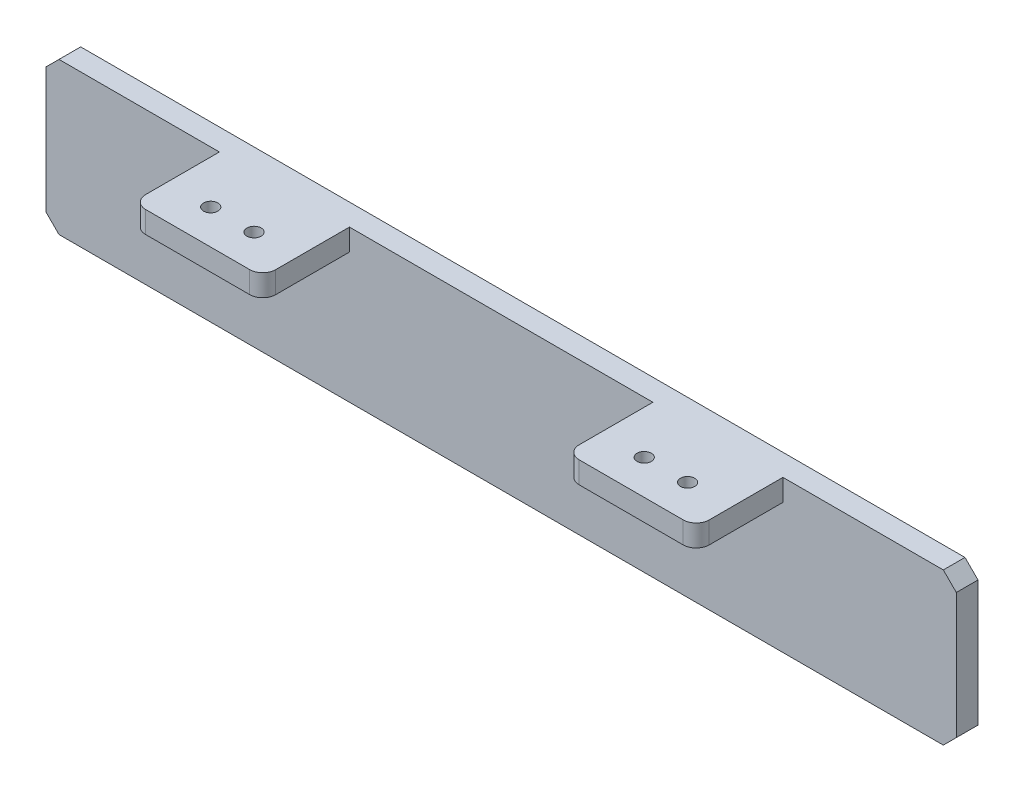
ISO-10303-21;
HEADER;
FILE_DESCRIPTION(('STEP AP214'),'2;1');
FILE_NAME('part.step','',(''),(''),'','','');
FILE_SCHEMA(('AUTOMOTIVE_DESIGN { 1 0 10303 214 1 1 1 1 }'));
ENDSEC;
DATA;
#1=APPLICATION_CONTEXT('core data for automotive mechanical design processes');
#2=APPLICATION_PROTOCOL_DEFINITION('international standard','automotive_design',2000,#1);
#3=PRODUCT_CONTEXT('',#1,'mechanical');
#4=PRODUCT('Part','Part','',(#3));
#5=PRODUCT_RELATED_PRODUCT_CATEGORY('part','',(#4));
#6=PRODUCT_DEFINITION_FORMATION('','',#4);
#7=PRODUCT_DEFINITION_CONTEXT('part definition',#1,'design');
#8=PRODUCT_DEFINITION('design','',#6,#7);
#9=PRODUCT_DEFINITION_SHAPE('','',#8);
#10=(LENGTH_UNIT() NAMED_UNIT(*) SI_UNIT(.MILLI.,.METRE.));
#11=(NAMED_UNIT(*) PLANE_ANGLE_UNIT() SI_UNIT($,.RADIAN.));
#12=(NAMED_UNIT(*) SI_UNIT($,.STERADIAN.) SOLID_ANGLE_UNIT());
#13=UNCERTAINTY_MEASURE_WITH_UNIT(LENGTH_MEASURE(1.E-05),#10,'distance_accuracy_value','');
#14=(GEOMETRIC_REPRESENTATION_CONTEXT(3) GLOBAL_UNCERTAINTY_ASSIGNED_CONTEXT((#13)) GLOBAL_UNIT_ASSIGNED_CONTEXT((#10,
#11,#12)) REPRESENTATION_CONTEXT('',''));
#15=CARTESIAN_POINT('',(0.,0.,0.));
#16=DIRECTION('',(0.,0.,1.));
#17=DIRECTION('',(1.,0.,0.));
#18=AXIS2_PLACEMENT_3D('',#15,#16,#17);
#19=CARTESIAN_POINT('',(0.,0.,5.));
#20=DIRECTION('',(0.,0.,-1.));
#21=DIRECTION('',(-1.,0.,0.));
#22=AXIS2_PLACEMENT_3D('',#19,#20,#21);
#23=PLANE('',#22);
#24=DIRECTION('',(0.,-1.,0.));
#25=VECTOR('',#24,1.);
#26=CARTESIAN_POINT('',(0.,0.,5.));
#27=LINE('',#26,#25);
#28=CARTESIAN_POINT('',(0.,32.,5.));
#29=VERTEX_POINT('',#28);
#30=CARTESIAN_POINT('',(0.,3.,5.));
#31=VERTEX_POINT('',#30);
#32=EDGE_CURVE('E241',#29,#31,#27,.T.);
#33=ORIENTED_EDGE('',*,*,#32,.T.);
#34=DIRECTION('',(-0.707106781186548,0.707106781186548,0.));
#35=VECTOR('',#34,1.);
#36=CARTESIAN_POINT('',(3.,0.,5.));
#37=LINE('',#36,#35);
#38=CARTESIAN_POINT('',(3.,0.,5.));
#39=VERTEX_POINT('',#38);
#40=EDGE_CURVE('E329',#31,#39,#37,.F.);
#41=ORIENTED_EDGE('',*,*,#40,.T.);
#42=DIRECTION('',(1.,0.,0.));
#43=VECTOR('',#42,1.);
#44=CARTESIAN_POINT('',(0.,0.,5.));
#45=LINE('',#44,#43);
#46=CARTESIAN_POINT('',(207.,0.,5.));
#47=VERTEX_POINT('',#46);
#48=EDGE_CURVE('E243',#39,#47,#45,.T.);
#49=ORIENTED_EDGE('',*,*,#48,.T.);
#50=DIRECTION('',(-0.707106781186548,-0.707106781186548,0.));
#51=VECTOR('',#50,1.);
#52=CARTESIAN_POINT('',(210.,3.,5.));
#53=LINE('',#52,#51);
#54=CARTESIAN_POINT('',(210.,3.,5.));
#55=VERTEX_POINT('',#54);
#56=EDGE_CURVE('E325',#47,#55,#53,.F.);
#57=ORIENTED_EDGE('',*,*,#56,.T.);
#58=DIRECTION('',(0.,1.,0.));
#59=VECTOR('',#58,1.);
#60=CARTESIAN_POINT('',(210.,0.,5.));
#61=LINE('',#60,#59);
#62=CARTESIAN_POINT('',(210.,32.,5.));
#63=VERTEX_POINT('',#62);
#64=EDGE_CURVE('E247',#55,#63,#61,.T.);
#65=ORIENTED_EDGE('',*,*,#64,.T.);
#66=DIRECTION('',(0.707106781186548,-0.707106781186548,0.));
#67=VECTOR('',#66,1.);
#68=CARTESIAN_POINT('',(207.,35.,5.));
#69=LINE('',#68,#67);
#70=CARTESIAN_POINT('',(207.,35.,5.));
#71=VERTEX_POINT('',#70);
#72=EDGE_CURVE('E57',#63,#71,#69,.F.);
#73=ORIENTED_EDGE('',*,*,#72,.T.);
#74=DIRECTION('',(-1.,0.,0.));
#75=VECTOR('',#74,1.);
#76=CARTESIAN_POINT('',(0.,35.,5.));
#77=LINE('',#76,#75);
#78=CARTESIAN_POINT('',(170.,35.,5.));
#79=VERTEX_POINT('',#78);
#80=EDGE_CURVE('E201',#71,#79,#77,.T.);
#81=ORIENTED_EDGE('',*,*,#80,.T.);
#82=DIRECTION('',(0.,1.,0.));
#83=VECTOR('',#82,1.);
#84=CARTESIAN_POINT('',(170.,35.,5.));
#85=LINE('',#84,#83);
#86=CARTESIAN_POINT('',(170.,30.,5.));
#87=VERTEX_POINT('',#86);
#88=EDGE_CURVE('E214',#87,#79,#85,.T.);
#89=ORIENTED_EDGE('',*,*,#88,.F.);
#90=DIRECTION('',(1.,0.,0.));
#91=VECTOR('',#90,1.);
#92=CARTESIAN_POINT('',(140.,30.,5.));
#93=LINE('',#92,#91);
#94=CARTESIAN_POINT('',(140.,30.,5.));
#95=VERTEX_POINT('',#94);
#96=EDGE_CURVE('E208',#95,#87,#93,.T.);
#97=ORIENTED_EDGE('',*,*,#96,.F.);
#98=DIRECTION('',(0.,-1.,0.));
#99=VECTOR('',#98,1.);
#100=CARTESIAN_POINT('',(140.,35.,5.));
#101=LINE('',#100,#99);
#102=CARTESIAN_POINT('',(140.,35.,5.));
#103=VERTEX_POINT('',#102);
#104=EDGE_CURVE('E185',#103,#95,#101,.T.);
#105=ORIENTED_EDGE('',*,*,#104,.F.);
#106=CARTESIAN_POINT('',(70.,35.,5.));
#107=VERTEX_POINT('',#106);
#108=EDGE_CURVE('E194',#103,#107,#77,.T.);
#109=ORIENTED_EDGE('',*,*,#108,.T.);
#110=DIRECTION('',(0.,1.,0.));
#111=VECTOR('',#110,1.);
#112=CARTESIAN_POINT('',(70.,35.,5.));
#113=LINE('',#112,#111);
#114=CARTESIAN_POINT('',(70.,30.,5.));
#115=VERTEX_POINT('',#114);
#116=EDGE_CURVE('E227',#115,#107,#113,.T.);
#117=ORIENTED_EDGE('',*,*,#116,.F.);
#118=DIRECTION('',(1.,0.,0.));
#119=VECTOR('',#118,1.);
#120=CARTESIAN_POINT('',(40.,30.,5.));
#121=LINE('',#120,#119);
#122=CARTESIAN_POINT('',(40.,30.,5.));
#123=VERTEX_POINT('',#122);
#124=EDGE_CURVE('E212',#123,#115,#121,.T.);
#125=ORIENTED_EDGE('',*,*,#124,.F.);
#126=DIRECTION('',(0.,-1.,0.));
#127=VECTOR('',#126,1.);
#128=CARTESIAN_POINT('',(40.,35.,5.));
#129=LINE('',#128,#127);
#130=CARTESIAN_POINT('',(40.,35.,5.));
#131=VERTEX_POINT('',#130);
#132=EDGE_CURVE('E209',#131,#123,#129,.T.);
#133=ORIENTED_EDGE('',*,*,#132,.F.);
#134=CARTESIAN_POINT('',(3.00000000000003,35.,5.));
#135=VERTEX_POINT('',#134);
#136=EDGE_CURVE('E202',#131,#135,#77,.T.);
#137=ORIENTED_EDGE('',*,*,#136,.T.);
#138=DIRECTION('',(0.707106781186551,0.707106781186544,0.));
#139=VECTOR('',#138,1.);
#140=CARTESIAN_POINT('',(0.,32.,5.));
#141=LINE('',#140,#139);
#142=EDGE_CURVE('E327',#135,#29,#141,.F.);
#143=ORIENTED_EDGE('',*,*,#142,.T.);
#144=EDGE_LOOP('',(#33,#41,#49,#57,#65,#73,#81,#89,#97,#105,#109,#117,#125,#133,#137,#143));
#145=FACE_BOUND('',#144,.T.);
#146=ADVANCED_FACE('F41',(#145),#23,.F.);
#147=CARTESIAN_POINT('',(0.,0.,5.));
#148=DIRECTION('',(1.,0.,0.));
#149=DIRECTION('',(0.,0.,-1.));
#150=AXIS2_PLACEMENT_3D('',#147,#148,#149);
#151=PLANE('',#150);
#152=DIRECTION('',(0.,-1.,0.));
#153=VECTOR('',#152,1.);
#154=CARTESIAN_POINT('',(0.,0.,0.));
#155=LINE('',#154,#153);
#156=CARTESIAN_POINT('',(0.,32.,0.));
#157=VERTEX_POINT('',#156);
#158=CARTESIAN_POINT('',(0.,3.,0.));
#159=VERTEX_POINT('',#158);
#160=EDGE_CURVE('E240',#157,#159,#155,.T.);
#161=ORIENTED_EDGE('',*,*,#160,.T.);
#162=DIRECTION('',(0.,0.,1.));
#163=VECTOR('',#162,1.);
#164=CARTESIAN_POINT('',(0.,3.,5.));
#165=LINE('',#164,#163);
#166=EDGE_CURVE('E322',#159,#31,#165,.T.);
#167=ORIENTED_EDGE('',*,*,#166,.T.);
#168=ORIENTED_EDGE('',*,*,#32,.F.);
#169=DIRECTION('',(0.,0.,-1.));
#170=VECTOR('',#169,1.);
#171=CARTESIAN_POINT('',(0.,32.,5.));
#172=LINE('',#171,#170);
#173=EDGE_CURVE('E319',#29,#157,#172,.T.);
#174=ORIENTED_EDGE('',*,*,#173,.T.);
#175=EDGE_LOOP('',(#161,#167,#168,#174));
#176=FACE_BOUND('',#175,.T.);
#177=ADVANCED_FACE('F349',(#176),#151,.F.);
#178=CARTESIAN_POINT('',(0.,0.,5.));
#179=DIRECTION('',(0.,1.,0.));
#180=DIRECTION('',(0.,0.,1.));
#181=AXIS2_PLACEMENT_3D('',#178,#179,#180);
#182=PLANE('',#181);
#183=ORIENTED_EDGE('',*,*,#48,.F.);
#184=DIRECTION('',(0.,0.,-1.));
#185=VECTOR('',#184,1.);
#186=CARTESIAN_POINT('',(3.,0.,5.));
#187=LINE('',#186,#185);
#188=CARTESIAN_POINT('',(3.,0.,0.));
#189=VERTEX_POINT('',#188);
#190=EDGE_CURVE('E308',#39,#189,#187,.T.);
#191=ORIENTED_EDGE('',*,*,#190,.T.);
#192=DIRECTION('',(1.,0.,0.));
#193=VECTOR('',#192,1.);
#194=CARTESIAN_POINT('',(0.,0.,0.));
#195=LINE('',#194,#193);
#196=CARTESIAN_POINT('',(207.,0.,0.));
#197=VERTEX_POINT('',#196);
#198=EDGE_CURVE('E252',#189,#197,#195,.T.);
#199=ORIENTED_EDGE('',*,*,#198,.T.);
#200=DIRECTION('',(0.,0.,1.));
#201=VECTOR('',#200,1.);
#202=CARTESIAN_POINT('',(207.,0.,5.));
#203=LINE('',#202,#201);
#204=EDGE_CURVE('E306',#197,#47,#203,.T.);
#205=ORIENTED_EDGE('',*,*,#204,.T.);
#206=EDGE_LOOP('',(#183,#191,#199,#205));
#207=FACE_BOUND('',#206,.T.);
#208=ADVANCED_FACE('F360',(#207),#182,.F.);
#209=CARTESIAN_POINT('',(210.,0.,5.));
#210=DIRECTION('',(-1.,0.,0.));
#211=DIRECTION('',(0.,0.,1.));
#212=AXIS2_PLACEMENT_3D('',#209,#210,#211);
#213=PLANE('',#212);
#214=ORIENTED_EDGE('',*,*,#64,.F.);
#215=DIRECTION('',(0.,0.,-1.));
#216=VECTOR('',#215,1.);
#217=CARTESIAN_POINT('',(210.,3.,5.));
#218=LINE('',#217,#216);
#219=CARTESIAN_POINT('',(210.,3.,0.));
#220=VERTEX_POINT('',#219);
#221=EDGE_CURVE('E11',#55,#220,#218,.T.);
#222=ORIENTED_EDGE('',*,*,#221,.T.);
#223=DIRECTION('',(0.,1.,0.));
#224=VECTOR('',#223,1.);
#225=CARTESIAN_POINT('',(210.,0.,0.));
#226=LINE('',#225,#224);
#227=CARTESIAN_POINT('',(210.,32.,0.));
#228=VERTEX_POINT('',#227);
#229=EDGE_CURVE('E255',#220,#228,#226,.T.);
#230=ORIENTED_EDGE('',*,*,#229,.T.);
#231=DIRECTION('',(0.,0.,1.));
#232=VECTOR('',#231,1.);
#233=CARTESIAN_POINT('',(210.,32.,5.));
#234=LINE('',#233,#232);
#235=EDGE_CURVE('E50',#228,#63,#234,.T.);
#236=ORIENTED_EDGE('',*,*,#235,.T.);
#237=EDGE_LOOP('',(#214,#222,#230,#236));
#238=FACE_BOUND('',#237,.T.);
#239=ADVANCED_FACE('F367',(#238),#213,.F.);
#240=CARTESIAN_POINT('',(0.,35.,5.));
#241=DIRECTION('',(0.,-1.,0.));
#242=DIRECTION('',(1.,0.,0.));
#243=AXIS2_PLACEMENT_3D('',#240,#241,#242);
#244=PLANE('',#243);
#245=CARTESIAN_POINT('',(160.,35.,17.));
#246=DIRECTION('',(0.,1.,0.));
#247=DIRECTION('',(0.,0.,1.));
#248=AXIS2_PLACEMENT_3D('',#245,#246,#247);
#249=CIRCLE('',#248,1.64999999999999);
#250=CARTESIAN_POINT('',(160.,35.,18.65));
#251=VERTEX_POINT('',#250);
#252=EDGE_CURVE('E262',#251,#251,#249,.T.);
#253=ORIENTED_EDGE('',*,*,#252,.F.);
#254=EDGE_LOOP('',(#253));
#255=FACE_BOUND('',#254,.T.);
#256=CARTESIAN_POINT('',(150.,35.,17.));
#257=DIRECTION('',(0.,1.,0.));
#258=DIRECTION('',(0.,0.,1.));
#259=AXIS2_PLACEMENT_3D('',#256,#257,#258);
#260=CIRCLE('',#259,1.64999999999996);
#261=CARTESIAN_POINT('',(150.,35.,18.6499999999999));
#262=VERTEX_POINT('',#261);
#263=EDGE_CURVE('E390',#262,#262,#260,.T.);
#264=ORIENTED_EDGE('',*,*,#263,.F.);
#265=EDGE_LOOP('',(#264));
#266=FACE_BOUND('',#265,.T.);
#267=CARTESIAN_POINT('',(60.,35.,17.));
#268=DIRECTION('',(0.,1.,0.));
#269=DIRECTION('',(0.,0.,1.));
#270=AXIS2_PLACEMENT_3D('',#267,#268,#269);
#271=CIRCLE('',#270,1.65);
#272=CARTESIAN_POINT('',(60.,35.,18.65));
#273=VERTEX_POINT('',#272);
#274=EDGE_CURVE('E387',#273,#273,#271,.T.);
#275=ORIENTED_EDGE('',*,*,#274,.F.);
#276=EDGE_LOOP('',(#275));
#277=FACE_BOUND('',#276,.T.);
#278=CARTESIAN_POINT('',(50.,35.,17.));
#279=DIRECTION('',(0.,1.,0.));
#280=DIRECTION('',(0.,0.,1.));
#281=AXIS2_PLACEMENT_3D('',#278,#279,#280);
#282=CIRCLE('',#281,1.65);
#283=CARTESIAN_POINT('',(50.,35.,18.65));
#284=VERTEX_POINT('',#283);
#285=EDGE_CURVE('E383',#284,#284,#282,.T.);
#286=ORIENTED_EDGE('',*,*,#285,.F.);
#287=EDGE_LOOP('',(#286));
#288=FACE_BOUND('',#287,.T.);
#289=DIRECTION('',(-1.,0.,0.));
#290=VECTOR('',#289,1.);
#291=CARTESIAN_POINT('',(0.,35.,0.));
#292=LINE('',#291,#290);
#293=CARTESIAN_POINT('',(207.,35.,0.));
#294=VERTEX_POINT('',#293);
#295=CARTESIAN_POINT('',(3.00000000000003,35.,0.));
#296=VERTEX_POINT('',#295);
#297=EDGE_CURVE('E244',#294,#296,#292,.T.);
#298=ORIENTED_EDGE('',*,*,#297,.T.);
#299=DIRECTION('',(0.,0.,1.));
#300=VECTOR('',#299,1.);
#301=CARTESIAN_POINT('',(3.00000000000003,35.,5.));
#302=LINE('',#301,#300);
#303=EDGE_CURVE('E334',#296,#135,#302,.T.);
#304=ORIENTED_EDGE('',*,*,#303,.T.);
#305=ORIENTED_EDGE('',*,*,#136,.F.);
#306=DIRECTION('',(0.,0.,-1.));
#307=VECTOR('',#306,1.);
#308=CARTESIAN_POINT('',(40.,35.,25.));
#309=LINE('',#308,#307);
#310=CARTESIAN_POINT('',(40.,35.,22.));
#311=VERTEX_POINT('',#310);
#312=EDGE_CURVE('E229',#311,#131,#309,.T.);
#313=ORIENTED_EDGE('',*,*,#312,.F.);
#314=CARTESIAN_POINT('',(43.,35.,22.));
#315=DIRECTION('',(0.,-1.,0.));
#316=DIRECTION('',(1.,0.,0.));
#317=AXIS2_PLACEMENT_3D('',#314,#315,#316);
#318=CIRCLE('',#317,3.);
#319=CARTESIAN_POINT('',(43.,35.,25.));
#320=VERTEX_POINT('',#319);
#321=EDGE_CURVE('E286',#311,#320,#318,.F.);
#322=ORIENTED_EDGE('',*,*,#321,.T.);
#323=DIRECTION('',(-1.,0.,0.));
#324=VECTOR('',#323,1.);
#325=CARTESIAN_POINT('',(40.,35.,25.));
#326=LINE('',#325,#324);
#327=CARTESIAN_POINT('',(67.,35.,25.));
#328=VERTEX_POINT('',#327);
#329=EDGE_CURVE('E226',#328,#320,#326,.T.);
#330=ORIENTED_EDGE('',*,*,#329,.F.);
#331=CARTESIAN_POINT('',(67.,35.,22.));
#332=DIRECTION('',(0.,-1.,0.));
#333=DIRECTION('',(1.,0.,0.));
#334=AXIS2_PLACEMENT_3D('',#331,#332,#333);
#335=CIRCLE('',#334,3.);
#336=CARTESIAN_POINT('',(70.,35.,22.));
#337=VERTEX_POINT('',#336);
#338=EDGE_CURVE('E282',#328,#337,#335,.F.);
#339=ORIENTED_EDGE('',*,*,#338,.T.);
#340=DIRECTION('',(0.,0.,-1.));
#341=VECTOR('',#340,1.);
#342=CARTESIAN_POINT('',(70.,35.,25.));
#343=LINE('',#342,#341);
#344=EDGE_CURVE('E198',#337,#107,#343,.T.);
#345=ORIENTED_EDGE('',*,*,#344,.T.);
#346=ORIENTED_EDGE('',*,*,#108,.F.);
#347=DIRECTION('',(0.,0.,-1.));
#348=VECTOR('',#347,1.);
#349=CARTESIAN_POINT('',(140.,35.,25.));
#350=LINE('',#349,#348);
#351=CARTESIAN_POINT('',(140.,35.,22.));
#352=VERTEX_POINT('',#351);
#353=EDGE_CURVE('E180',#352,#103,#350,.T.);
#354=ORIENTED_EDGE('',*,*,#353,.F.);
#355=CARTESIAN_POINT('',(143.,35.,22.));
#356=DIRECTION('',(0.,-1.,0.));
#357=DIRECTION('',(1.,0.,0.));
#358=AXIS2_PLACEMENT_3D('',#355,#356,#357);
#359=CIRCLE('',#358,3.);
#360=CARTESIAN_POINT('',(143.,35.,25.));
#361=VERTEX_POINT('',#360);
#362=EDGE_CURVE('E288',#352,#361,#359,.F.);
#363=ORIENTED_EDGE('',*,*,#362,.T.);
#364=DIRECTION('',(-1.,0.,0.));
#365=VECTOR('',#364,1.);
#366=CARTESIAN_POINT('',(140.,35.,25.));
#367=LINE('',#366,#365);
#368=CARTESIAN_POINT('',(167.,35.,25.));
#369=VERTEX_POINT('',#368);
#370=EDGE_CURVE('E190',#369,#361,#367,.T.);
#371=ORIENTED_EDGE('',*,*,#370,.F.);
#372=CARTESIAN_POINT('',(167.,35.,22.));
#373=DIRECTION('',(0.,-1.,0.));
#374=DIRECTION('',(1.,0.,0.));
#375=AXIS2_PLACEMENT_3D('',#372,#373,#374);
#376=CIRCLE('',#375,3.);
#377=CARTESIAN_POINT('',(170.,35.,22.));
#378=VERTEX_POINT('',#377);
#379=EDGE_CURVE('E284',#369,#378,#376,.F.);
#380=ORIENTED_EDGE('',*,*,#379,.T.);
#381=DIRECTION('',(0.,0.,-1.));
#382=VECTOR('',#381,1.);
#383=CARTESIAN_POINT('',(170.,35.,25.));
#384=LINE('',#383,#382);
#385=EDGE_CURVE('E191',#378,#79,#384,.T.);
#386=ORIENTED_EDGE('',*,*,#385,.T.);
#387=ORIENTED_EDGE('',*,*,#80,.F.);
#388=DIRECTION('',(0.,0.,-1.));
#389=VECTOR('',#388,1.);
#390=CARTESIAN_POINT('',(207.,35.,5.));
#391=LINE('',#390,#389);
#392=EDGE_CURVE('E331',#71,#294,#391,.T.);
#393=ORIENTED_EDGE('',*,*,#392,.T.);
#394=EDGE_LOOP('',(#298,#304,#305,#313,#322,#330,#339,#345,#346,#354,#363,#371,#380,#386,#387,#393));
#395=FACE_BOUND('',#394,.T.);
#396=ADVANCED_FACE('F196',(#255,#266,#277,#288,#395),#244,.F.);
#397=CARTESIAN_POINT('',(0.,0.,0.));
#398=DIRECTION('',(0.,0.,-1.));
#399=DIRECTION('',(-1.,0.,0.));
#400=AXIS2_PLACEMENT_3D('',#397,#398,#399);
#401=PLANE('',#400);
#402=ORIENTED_EDGE('',*,*,#198,.F.);
#403=DIRECTION('',(0.707106781186548,-0.707106781186548,0.));
#404=VECTOR('',#403,1.);
#405=CARTESIAN_POINT('',(1.5,1.5,0.));
#406=LINE('',#405,#404);
#407=EDGE_CURVE('E317',#189,#159,#406,.F.);
#408=ORIENTED_EDGE('',*,*,#407,.T.);
#409=ORIENTED_EDGE('',*,*,#160,.F.);
#410=DIRECTION('',(-0.707106781186551,-0.707106781186544,0.));
#411=VECTOR('',#410,1.);
#412=CARTESIAN_POINT('',(-16.,16.0000000000002,0.));
#413=LINE('',#412,#411);
#414=EDGE_CURVE('E315',#157,#296,#413,.F.);
#415=ORIENTED_EDGE('',*,*,#414,.T.);
#416=ORIENTED_EDGE('',*,*,#297,.F.);
#417=DIRECTION('',(-0.707106781186548,0.707106781186548,0.));
#418=VECTOR('',#417,1.);
#419=CARTESIAN_POINT('',(121.,121.,0.));
#420=LINE('',#419,#418);
#421=EDGE_CURVE('E311',#294,#228,#420,.F.);
#422=ORIENTED_EDGE('',*,*,#421,.T.);
#423=ORIENTED_EDGE('',*,*,#229,.F.);
#424=DIRECTION('',(0.707106781186548,0.707106781186548,0.));
#425=VECTOR('',#424,1.);
#426=CARTESIAN_POINT('',(103.5,-103.5,0.));
#427=LINE('',#426,#425);
#428=EDGE_CURVE('E313',#220,#197,#427,.F.);
#429=ORIENTED_EDGE('',*,*,#428,.T.);
#430=EDGE_LOOP('',(#402,#408,#409,#415,#416,#422,#423,#429));
#431=FACE_BOUND('',#430,.T.);
#432=ADVANCED_FACE('F353',(#431),#401,.T.);
#433=CARTESIAN_POINT('',(40.,35.,25.));
#434=DIRECTION('',(1.,0.,0.));
#435=DIRECTION('',(0.,1.,0.));
#436=AXIS2_PLACEMENT_3D('',#433,#434,#435);
#437=PLANE('',#436);
#438=DIRECTION('',(0.,0.,-1.));
#439=VECTOR('',#438,1.);
#440=CARTESIAN_POINT('',(40.,30.,25.));
#441=LINE('',#440,#439);
#442=CARTESIAN_POINT('',(40.,30.,22.));
#443=VERTEX_POINT('',#442);
#444=EDGE_CURVE('E238',#443,#123,#441,.T.);
#445=ORIENTED_EDGE('',*,*,#444,.F.);
#446=DIRECTION('',(0.,-1.,0.));
#447=VECTOR('',#446,1.);
#448=CARTESIAN_POINT('',(40.,35.,22.));
#449=LINE('',#448,#447);
#450=EDGE_CURVE('E300',#443,#311,#449,.F.);
#451=ORIENTED_EDGE('',*,*,#450,.T.);
#452=ORIENTED_EDGE('',*,*,#312,.T.);
#453=ORIENTED_EDGE('',*,*,#132,.T.);
#454=EDGE_LOOP('',(#445,#451,#452,#453));
#455=FACE_BOUND('',#454,.T.);
#456=ADVANCED_FACE('F419',(#455),#437,.F.);
#457=CARTESIAN_POINT('',(40.,30.,25.));
#458=DIRECTION('',(0.,1.,0.));
#459=DIRECTION('',(0.,0.,1.));
#460=AXIS2_PLACEMENT_3D('',#457,#458,#459);
#461=PLANE('',#460);
#462=CARTESIAN_POINT('',(60.,30.,17.));
#463=DIRECTION('',(0.,1.,0.));
#464=DIRECTION('',(0.,0.,1.));
#465=AXIS2_PLACEMENT_3D('',#462,#463,#464);
#466=CIRCLE('',#465,1.65);
#467=CARTESIAN_POINT('',(60.,30.,18.65));
#468=VERTEX_POINT('',#467);
#469=EDGE_CURVE('E268',#468,#468,#466,.T.);
#470=ORIENTED_EDGE('',*,*,#469,.T.);
#471=EDGE_LOOP('',(#470));
#472=FACE_BOUND('',#471,.T.);
#473=CARTESIAN_POINT('',(50.,30.,17.));
#474=DIRECTION('',(0.,1.,0.));
#475=DIRECTION('',(0.,0.,1.));
#476=AXIS2_PLACEMENT_3D('',#473,#474,#475);
#477=CIRCLE('',#476,1.65);
#478=CARTESIAN_POINT('',(50.,30.,18.65));
#479=VERTEX_POINT('',#478);
#480=EDGE_CURVE('E265',#479,#479,#477,.T.);
#481=ORIENTED_EDGE('',*,*,#480,.T.);
#482=EDGE_LOOP('',(#481));
#483=FACE_BOUND('',#482,.T.);
#484=DIRECTION('',(1.,0.,0.));
#485=VECTOR('',#484,1.);
#486=CARTESIAN_POINT('',(40.,30.,25.));
#487=LINE('',#486,#485);
#488=CARTESIAN_POINT('',(43.,30.,25.));
#489=VERTEX_POINT('',#488);
#490=CARTESIAN_POINT('',(67.,30.,25.));
#491=VERTEX_POINT('',#490);
#492=EDGE_CURVE('E223',#489,#491,#487,.T.);
#493=ORIENTED_EDGE('',*,*,#492,.F.);
#494=CARTESIAN_POINT('',(43.,30.,22.));
#495=DIRECTION('',(0.,1.,0.));
#496=DIRECTION('',(0.,0.,1.));
#497=AXIS2_PLACEMENT_3D('',#494,#495,#496);
#498=CIRCLE('',#497,3.);
#499=EDGE_CURVE('E298',#489,#443,#498,.F.);
#500=ORIENTED_EDGE('',*,*,#499,.T.);
#501=ORIENTED_EDGE('',*,*,#444,.T.);
#502=ORIENTED_EDGE('',*,*,#124,.T.);
#503=DIRECTION('',(0.,0.,-1.));
#504=VECTOR('',#503,1.);
#505=CARTESIAN_POINT('',(70.,30.,25.));
#506=LINE('',#505,#504);
#507=CARTESIAN_POINT('',(70.,30.,22.));
#508=VERTEX_POINT('',#507);
#509=EDGE_CURVE('E236',#508,#115,#506,.T.);
#510=ORIENTED_EDGE('',*,*,#509,.F.);
#511=CARTESIAN_POINT('',(67.,30.,22.));
#512=DIRECTION('',(0.,1.,0.));
#513=DIRECTION('',(0.,0.,1.));
#514=AXIS2_PLACEMENT_3D('',#511,#512,#513);
#515=CIRCLE('',#514,3.);
#516=EDGE_CURVE('E296',#508,#491,#515,.F.);
#517=ORIENTED_EDGE('',*,*,#516,.T.);
#518=EDGE_LOOP('',(#493,#500,#501,#502,#510,#517));
#519=FACE_BOUND('',#518,.T.);
#520=ADVANCED_FACE('F415',(#472,#483,#519),#461,.F.);
#521=CARTESIAN_POINT('',(70.,35.,25.));
#522=DIRECTION('',(-1.,0.,0.));
#523=DIRECTION('',(0.,0.,1.));
#524=AXIS2_PLACEMENT_3D('',#521,#522,#523);
#525=PLANE('',#524);
#526=ORIENTED_EDGE('',*,*,#344,.F.);
#527=DIRECTION('',(0.,1.,0.));
#528=VECTOR('',#527,1.);
#529=CARTESIAN_POINT('',(70.,30.,22.));
#530=LINE('',#529,#528);
#531=EDGE_CURVE('E304',#337,#508,#530,.F.);
#532=ORIENTED_EDGE('',*,*,#531,.T.);
#533=ORIENTED_EDGE('',*,*,#509,.T.);
#534=ORIENTED_EDGE('',*,*,#116,.T.);
#535=EDGE_LOOP('',(#526,#532,#533,#534));
#536=FACE_BOUND('',#535,.T.);
#537=ADVANCED_FACE('F418',(#536),#525,.F.);
#538=CARTESIAN_POINT('',(0.,0.,25.));
#539=DIRECTION('',(0.,0.,1.));
#540=DIRECTION('',(1.,0.,0.));
#541=AXIS2_PLACEMENT_3D('',#538,#539,#540);
#542=PLANE('',#541);
#543=ORIENTED_EDGE('',*,*,#329,.T.);
#544=DIRECTION('',(0.,-1.,0.));
#545=VECTOR('',#544,1.);
#546=CARTESIAN_POINT('',(43.,30.,25.));
#547=LINE('',#546,#545);
#548=EDGE_CURVE('E293',#320,#489,#547,.T.);
#549=ORIENTED_EDGE('',*,*,#548,.T.);
#550=ORIENTED_EDGE('',*,*,#492,.T.);
#551=DIRECTION('',(0.,1.,0.));
#552=VECTOR('',#551,1.);
#553=CARTESIAN_POINT('',(67.,35.,25.));
#554=LINE('',#553,#552);
#555=EDGE_CURVE('E290',#491,#328,#554,.T.);
#556=ORIENTED_EDGE('',*,*,#555,.T.);
#557=EDGE_LOOP('',(#543,#549,#550,#556));
#558=FACE_BOUND('',#557,.T.);
#559=ADVANCED_FACE('F428',(#558),#542,.T.);
#560=CARTESIAN_POINT('',(140.,35.,25.));
#561=DIRECTION('',(1.,0.,0.));
#562=DIRECTION('',(0.,0.,-1.));
#563=AXIS2_PLACEMENT_3D('',#560,#561,#562);
#564=PLANE('',#563);
#565=DIRECTION('',(0.,0.,-1.));
#566=VECTOR('',#565,1.);
#567=CARTESIAN_POINT('',(140.,30.,25.));
#568=LINE('',#567,#566);
#569=CARTESIAN_POINT('',(140.,30.,22.));
#570=VERTEX_POINT('',#569);
#571=EDGE_CURVE('E271',#570,#95,#568,.T.);
#572=ORIENTED_EDGE('',*,*,#571,.F.);
#573=DIRECTION('',(0.,-1.,0.));
#574=VECTOR('',#573,1.);
#575=CARTESIAN_POINT('',(140.,35.,22.));
#576=LINE('',#575,#574);
#577=EDGE_CURVE('E187',#570,#352,#576,.F.);
#578=ORIENTED_EDGE('',*,*,#577,.T.);
#579=ORIENTED_EDGE('',*,*,#353,.T.);
#580=ORIENTED_EDGE('',*,*,#104,.T.);
#581=EDGE_LOOP('',(#572,#578,#579,#580));
#582=FACE_BOUND('',#581,.T.);
#583=ADVANCED_FACE('F183',(#582),#564,.F.);
#584=CARTESIAN_POINT('',(140.,30.,25.));
#585=DIRECTION('',(0.,1.,0.));
#586=DIRECTION('',(-1.,0.,0.));
#587=AXIS2_PLACEMENT_3D('',#584,#585,#586);
#588=PLANE('',#587);
#589=CARTESIAN_POINT('',(160.,30.,17.));
#590=DIRECTION('',(0.,1.,0.));
#591=DIRECTION('',(-1.,0.,0.));
#592=AXIS2_PLACEMENT_3D('',#589,#590,#591);
#593=CIRCLE('',#592,1.64999999999999);
#594=CARTESIAN_POINT('',(158.35,30.,17.));
#595=VERTEX_POINT('',#594);
#596=EDGE_CURVE('E261',#595,#595,#593,.T.);
#597=ORIENTED_EDGE('',*,*,#596,.T.);
#598=EDGE_LOOP('',(#597));
#599=FACE_BOUND('',#598,.T.);
#600=CARTESIAN_POINT('',(150.,30.,17.));
#601=DIRECTION('',(0.,1.,0.));
#602=DIRECTION('',(-1.,0.,0.));
#603=AXIS2_PLACEMENT_3D('',#600,#601,#602);
#604=CIRCLE('',#603,1.64999999999996);
#605=CARTESIAN_POINT('',(148.35,30.,17.));
#606=VERTEX_POINT('',#605);
#607=EDGE_CURVE('E258',#606,#606,#604,.T.);
#608=ORIENTED_EDGE('',*,*,#607,.T.);
#609=EDGE_LOOP('',(#608));
#610=FACE_BOUND('',#609,.T.);
#611=DIRECTION('',(1.,0.,0.));
#612=VECTOR('',#611,1.);
#613=CARTESIAN_POINT('',(140.,30.,25.));
#614=LINE('',#613,#612);
#615=CARTESIAN_POINT('',(143.,30.,25.));
#616=VERTEX_POINT('',#615);
#617=CARTESIAN_POINT('',(167.,30.,25.));
#618=VERTEX_POINT('',#617);
#619=EDGE_CURVE('E220',#616,#618,#614,.T.);
#620=ORIENTED_EDGE('',*,*,#619,.F.);
#621=CARTESIAN_POINT('',(143.,30.,22.));
#622=DIRECTION('',(0.,1.,0.));
#623=DIRECTION('',(-1.,0.,0.));
#624=AXIS2_PLACEMENT_3D('',#621,#622,#623);
#625=CIRCLE('',#624,3.);
#626=EDGE_CURVE('E279',#616,#570,#625,.F.);
#627=ORIENTED_EDGE('',*,*,#626,.T.);
#628=ORIENTED_EDGE('',*,*,#571,.T.);
#629=ORIENTED_EDGE('',*,*,#96,.T.);
#630=DIRECTION('',(0.,0.,-1.));
#631=VECTOR('',#630,1.);
#632=CARTESIAN_POINT('',(170.,30.,25.));
#633=LINE('',#632,#631);
#634=CARTESIAN_POINT('',(170.,30.,22.));
#635=VERTEX_POINT('',#634);
#636=EDGE_CURVE('E378',#635,#87,#633,.T.);
#637=ORIENTED_EDGE('',*,*,#636,.F.);
#638=CARTESIAN_POINT('',(167.,30.,22.));
#639=DIRECTION('',(0.,1.,0.));
#640=DIRECTION('',(-1.,0.,0.));
#641=AXIS2_PLACEMENT_3D('',#638,#639,#640);
#642=CIRCLE('',#641,3.);
#643=EDGE_CURVE('E277',#635,#618,#642,.F.);
#644=ORIENTED_EDGE('',*,*,#643,.T.);
#645=EDGE_LOOP('',(#620,#627,#628,#629,#637,#644));
#646=FACE_BOUND('',#645,.T.);
#647=ADVANCED_FACE('F377',(#599,#610,#646),#588,.F.);
#648=CARTESIAN_POINT('',(170.,35.,25.));
#649=DIRECTION('',(-1.,0.,0.));
#650=DIRECTION('',(0.,0.,1.));
#651=AXIS2_PLACEMENT_3D('',#648,#649,#650);
#652=PLANE('',#651);
#653=ORIENTED_EDGE('',*,*,#385,.F.);
#654=DIRECTION('',(0.,1.,0.));
#655=VECTOR('',#654,1.);
#656=CARTESIAN_POINT('',(170.,30.,22.));
#657=LINE('',#656,#655);
#658=EDGE_CURVE('E302',#378,#635,#657,.F.);
#659=ORIENTED_EDGE('',*,*,#658,.T.);
#660=ORIENTED_EDGE('',*,*,#636,.T.);
#661=ORIENTED_EDGE('',*,*,#88,.T.);
#662=EDGE_LOOP('',(#653,#659,#660,#661));
#663=FACE_BOUND('',#662,.T.);
#664=ADVANCED_FACE('F516',(#663),#652,.F.);
#665=CARTESIAN_POINT('',(0.,0.,25.));
#666=DIRECTION('',(0.,0.,1.));
#667=DIRECTION('',(1.,0.,0.));
#668=AXIS2_PLACEMENT_3D('',#665,#666,#667);
#669=PLANE('',#668);
#670=ORIENTED_EDGE('',*,*,#370,.T.);
#671=DIRECTION('',(0.,-1.,0.));
#672=VECTOR('',#671,1.);
#673=CARTESIAN_POINT('',(143.,30.,25.));
#674=LINE('',#673,#672);
#675=EDGE_CURVE('E274',#361,#616,#674,.T.);
#676=ORIENTED_EDGE('',*,*,#675,.T.);
#677=ORIENTED_EDGE('',*,*,#619,.T.);
#678=DIRECTION('',(0.,1.,0.));
#679=VECTOR('',#678,1.);
#680=CARTESIAN_POINT('',(167.,35.,25.));
#681=LINE('',#680,#679);
#682=EDGE_CURVE('E249',#618,#369,#681,.T.);
#683=ORIENTED_EDGE('',*,*,#682,.T.);
#684=EDGE_LOOP('',(#670,#676,#677,#683));
#685=FACE_BOUND('',#684,.T.);
#686=ADVANCED_FACE('F524',(#685),#669,.T.);
#687=CARTESIAN_POINT('',(150.,25.,17.));
#688=DIRECTION('',(0.,1.,0.));
#689=DIRECTION('',(0.,0.,1.));
#690=AXIS2_PLACEMENT_3D('',#687,#688,#689);
#691=CYLINDRICAL_SURFACE('',#690,1.64999999999996);
#692=ORIENTED_EDGE('',*,*,#263,.T.);
#693=EDGE_LOOP('',(#692));
#694=FACE_BOUND('',#693,.T.);
#695=ORIENTED_EDGE('',*,*,#607,.F.);
#696=EDGE_LOOP('',(#695));
#697=FACE_BOUND('',#696,.T.);
#698=ADVANCED_FACE('F531',(#694,#697),#691,.F.);
#699=CARTESIAN_POINT('',(160.,25.,17.));
#700=DIRECTION('',(0.,1.,0.));
#701=DIRECTION('',(0.,0.,1.));
#702=AXIS2_PLACEMENT_3D('',#699,#700,#701);
#703=CYLINDRICAL_SURFACE('',#702,1.64999999999999);
#704=ORIENTED_EDGE('',*,*,#252,.T.);
#705=EDGE_LOOP('',(#704));
#706=FACE_BOUND('',#705,.T.);
#707=ORIENTED_EDGE('',*,*,#596,.F.);
#708=EDGE_LOOP('',(#707));
#709=FACE_BOUND('',#708,.T.);
#710=ADVANCED_FACE('F396',(#706,#709),#703,.F.);
#711=CARTESIAN_POINT('',(50.,25.,17.));
#712=DIRECTION('',(0.,1.,0.));
#713=DIRECTION('',(0.,0.,1.));
#714=AXIS2_PLACEMENT_3D('',#711,#712,#713);
#715=CYLINDRICAL_SURFACE('',#714,1.65);
#716=ORIENTED_EDGE('',*,*,#285,.T.);
#717=EDGE_LOOP('',(#716));
#718=FACE_BOUND('',#717,.T.);
#719=ORIENTED_EDGE('',*,*,#480,.F.);
#720=EDGE_LOOP('',(#719));
#721=FACE_BOUND('',#720,.T.);
#722=ADVANCED_FACE('F408',(#718,#721),#715,.F.);
#723=CARTESIAN_POINT('',(60.,25.,17.));
#724=DIRECTION('',(0.,1.,0.));
#725=DIRECTION('',(0.,0.,1.));
#726=AXIS2_PLACEMENT_3D('',#723,#724,#725);
#727=CYLINDRICAL_SURFACE('',#726,1.65);
#728=ORIENTED_EDGE('',*,*,#274,.T.);
#729=EDGE_LOOP('',(#728));
#730=FACE_BOUND('',#729,.T.);
#731=ORIENTED_EDGE('',*,*,#469,.F.);
#732=EDGE_LOOP('',(#731));
#733=FACE_BOUND('',#732,.T.);
#734=ADVANCED_FACE('F411',(#730,#733),#727,.F.);
#735=CARTESIAN_POINT('',(143.,0.,22.));
#736=DIRECTION('',(0.,1.,0.));
#737=DIRECTION('',(0.,0.,1.));
#738=AXIS2_PLACEMENT_3D('',#735,#736,#737);
#739=CYLINDRICAL_SURFACE('',#738,3.);
#740=ORIENTED_EDGE('',*,*,#362,.F.);
#741=ORIENTED_EDGE('',*,*,#577,.F.);
#742=ORIENTED_EDGE('',*,*,#626,.F.);
#743=ORIENTED_EDGE('',*,*,#675,.F.);
#744=EDGE_LOOP('',(#740,#741,#742,#743));
#745=FACE_BOUND('',#744,.T.);
#746=ADVANCED_FACE('F442',(#745),#739,.T.);
#747=CARTESIAN_POINT('',(43.,0.,22.));
#748=DIRECTION('',(0.,1.,0.));
#749=DIRECTION('',(-1.,0.,0.));
#750=AXIS2_PLACEMENT_3D('',#747,#748,#749);
#751=CYLINDRICAL_SURFACE('',#750,3.);
#752=ORIENTED_EDGE('',*,*,#321,.F.);
#753=ORIENTED_EDGE('',*,*,#450,.F.);
#754=ORIENTED_EDGE('',*,*,#499,.F.);
#755=ORIENTED_EDGE('',*,*,#548,.F.);
#756=EDGE_LOOP('',(#752,#753,#754,#755));
#757=FACE_BOUND('',#756,.T.);
#758=ADVANCED_FACE('F439',(#757),#751,.T.);
#759=CARTESIAN_POINT('',(167.,0.,22.));
#760=DIRECTION('',(0.,-1.,0.));
#761=DIRECTION('',(0.,0.,-1.));
#762=AXIS2_PLACEMENT_3D('',#759,#760,#761);
#763=CYLINDRICAL_SURFACE('',#762,3.);
#764=ORIENTED_EDGE('',*,*,#643,.F.);
#765=ORIENTED_EDGE('',*,*,#658,.F.);
#766=ORIENTED_EDGE('',*,*,#379,.F.);
#767=ORIENTED_EDGE('',*,*,#682,.F.);
#768=EDGE_LOOP('',(#764,#765,#766,#767));
#769=FACE_BOUND('',#768,.T.);
#770=ADVANCED_FACE('F441',(#769),#763,.T.);
#771=CARTESIAN_POINT('',(67.,0.,22.));
#772=DIRECTION('',(0.,-1.,0.));
#773=DIRECTION('',(0.,0.,-1.));
#774=AXIS2_PLACEMENT_3D('',#771,#772,#773);
#775=CYLINDRICAL_SURFACE('',#774,3.);
#776=ORIENTED_EDGE('',*,*,#516,.F.);
#777=ORIENTED_EDGE('',*,*,#531,.F.);
#778=ORIENTED_EDGE('',*,*,#338,.F.);
#779=ORIENTED_EDGE('',*,*,#555,.F.);
#780=EDGE_LOOP('',(#776,#777,#778,#779));
#781=FACE_BOUND('',#780,.T.);
#782=ADVANCED_FACE('F432',(#781),#775,.T.);
#783=CARTESIAN_POINT('',(3.,0.,5.));
#784=DIRECTION('',(0.707106781186547,0.707106781186547,0.));
#785=DIRECTION('',(0.,0.,-1.));
#786=AXIS2_PLACEMENT_3D('',#783,#784,#785);
#787=PLANE('',#786);
#788=ORIENTED_EDGE('',*,*,#40,.F.);
#789=ORIENTED_EDGE('',*,*,#166,.F.);
#790=ORIENTED_EDGE('',*,*,#407,.F.);
#791=ORIENTED_EDGE('',*,*,#190,.F.);
#792=EDGE_LOOP('',(#788,#789,#790,#791));
#793=FACE_BOUND('',#792,.T.);
#794=ADVANCED_FACE('F357',(#793),#787,.F.);
#795=CARTESIAN_POINT('',(0.,32.,5.));
#796=DIRECTION('',(0.707106781186544,-0.707106781186551,0.));
#797=DIRECTION('',(0.,0.,-1.));
#798=AXIS2_PLACEMENT_3D('',#795,#796,#797);
#799=PLANE('',#798);
#800=ORIENTED_EDGE('',*,*,#142,.F.);
#801=ORIENTED_EDGE('',*,*,#303,.F.);
#802=ORIENTED_EDGE('',*,*,#414,.F.);
#803=ORIENTED_EDGE('',*,*,#173,.F.);
#804=EDGE_LOOP('',(#800,#801,#802,#803));
#805=FACE_BOUND('',#804,.T.);
#806=ADVANCED_FACE('F346',(#805),#799,.F.);
#807=CARTESIAN_POINT('',(210.,3.,5.));
#808=DIRECTION('',(-0.707106781186547,0.707106781186547,0.));
#809=DIRECTION('',(0.,0.,-1.));
#810=AXIS2_PLACEMENT_3D('',#807,#808,#809);
#811=PLANE('',#810);
#812=ORIENTED_EDGE('',*,*,#56,.F.);
#813=ORIENTED_EDGE('',*,*,#204,.F.);
#814=ORIENTED_EDGE('',*,*,#428,.F.);
#815=ORIENTED_EDGE('',*,*,#221,.F.);
#816=EDGE_LOOP('',(#812,#813,#814,#815));
#817=FACE_BOUND('',#816,.T.);
#818=ADVANCED_FACE('F365',(#817),#811,.F.);
#819=CARTESIAN_POINT('',(207.,35.,5.));
#820=DIRECTION('',(-0.707106781186548,-0.707106781186548,0.));
#821=DIRECTION('',(0.,0.,-1.));
#822=AXIS2_PLACEMENT_3D('',#819,#820,#821);
#823=PLANE('',#822);
#824=ORIENTED_EDGE('',*,*,#72,.F.);
#825=ORIENTED_EDGE('',*,*,#235,.F.);
#826=ORIENTED_EDGE('',*,*,#421,.F.);
#827=ORIENTED_EDGE('',*,*,#392,.F.);
#828=EDGE_LOOP('',(#824,#825,#826,#827));
#829=FACE_BOUND('',#828,.T.);
#830=ADVANCED_FACE('F44',(#829),#823,.F.);
#831=CLOSED_SHELL('',(#146,#177,#208,#239,#396,#432,#456,#520,#537,#559,#583,#647,#664,#686,
#698,#710,#722,#734,#746,#758,#770,#782,#794,#806,#818,#830));
#832=MANIFOLD_SOLID_BREP('B2',#831);
#833=ADVANCED_BREP_SHAPE_REPRESENTATION('',(#18,#832),#14);
#834=SHAPE_DEFINITION_REPRESENTATION(#9,#833);
ENDSEC;
END-ISO-10303-21;
